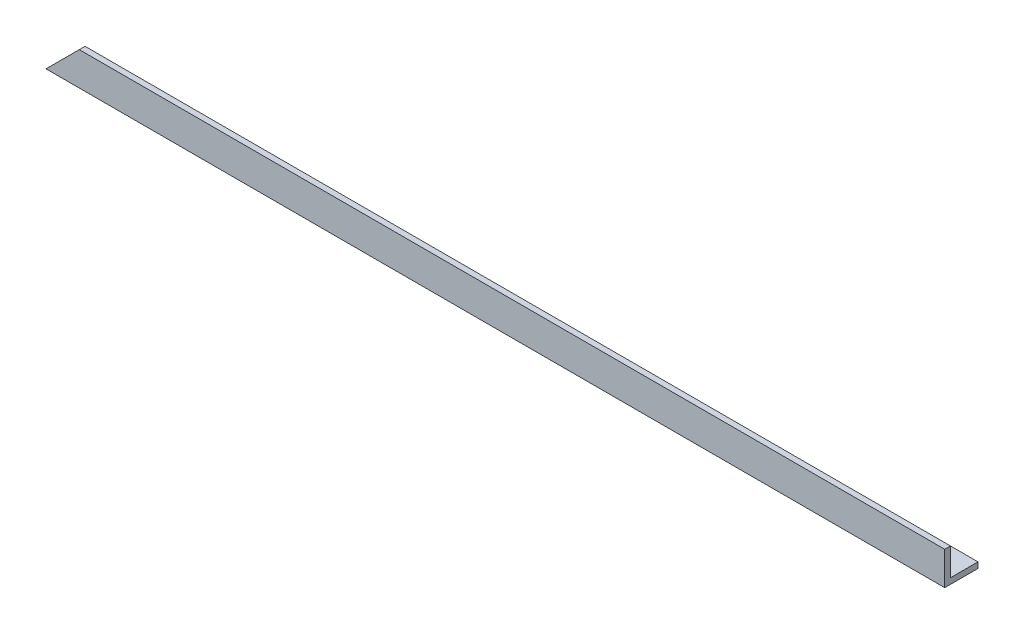
ISO-10303-21;
HEADER;
FILE_DESCRIPTION(('STEP AP214'),'2;1');
FILE_NAME('part.step','',(''),(''),'','','');
FILE_SCHEMA(('AUTOMOTIVE_DESIGN { 1 0 10303 214 1 1 1 1 }'));
ENDSEC;
DATA;
#1=APPLICATION_CONTEXT('core data for automotive mechanical design processes');
#2=APPLICATION_PROTOCOL_DEFINITION('international standard','automotive_design',2000,#1);
#3=PRODUCT_CONTEXT('',#1,'mechanical');
#4=PRODUCT('Part','Part','',(#3));
#5=PRODUCT_RELATED_PRODUCT_CATEGORY('part','',(#4));
#6=PRODUCT_DEFINITION_FORMATION('','',#4);
#7=PRODUCT_DEFINITION_CONTEXT('part definition',#1,'design');
#8=PRODUCT_DEFINITION('design','',#6,#7);
#9=PRODUCT_DEFINITION_SHAPE('','',#8);
#10=(LENGTH_UNIT() NAMED_UNIT(*) SI_UNIT(.MILLI.,.METRE.));
#11=(NAMED_UNIT(*) PLANE_ANGLE_UNIT() SI_UNIT($,.RADIAN.));
#12=(NAMED_UNIT(*) SI_UNIT($,.STERADIAN.) SOLID_ANGLE_UNIT());
#13=UNCERTAINTY_MEASURE_WITH_UNIT(LENGTH_MEASURE(1.E-05),#10,'distance_accuracy_value','');
#14=(GEOMETRIC_REPRESENTATION_CONTEXT(3) GLOBAL_UNCERTAINTY_ASSIGNED_CONTEXT((#13)) GLOBAL_UNIT_ASSIGNED_CONTEXT((#10,
#11,#12)) REPRESENTATION_CONTEXT('',''));
#15=CARTESIAN_POINT('',(0.,0.,0.));
#16=DIRECTION('',(0.,0.,1.));
#17=DIRECTION('',(1.,0.,0.));
#18=AXIS2_PLACEMENT_3D('',#15,#16,#17);
#19=CARTESIAN_POINT('',(540.,20.,0.));
#20=DIRECTION('',(0.,0.,-1.));
#21=DIRECTION('',(0.,1.,0.));
#22=AXIS2_PLACEMENT_3D('',#19,#20,#21);
#23=PLANE('',#22);
#24=DIRECTION('',(-0.707106781186548,-0.707106781186548,0.));
#25=VECTOR('',#24,1.);
#26=CARTESIAN_POINT('',(0.,0.,0.));
#27=LINE('',#26,#25);
#28=CARTESIAN_POINT('',(20.,20.,0.));
#29=VERTEX_POINT('',#28);
#30=CARTESIAN_POINT('',(0.,0.,0.));
#31=VERTEX_POINT('',#30);
#32=EDGE_CURVE('E84',#29,#31,#27,.T.);
#33=ORIENTED_EDGE('',*,*,#32,.T.);
#34=DIRECTION('',(-1.,0.,0.));
#35=VECTOR('',#34,1.);
#36=CARTESIAN_POINT('',(540.,0.,0.));
#37=LINE('',#36,#35);
#38=CARTESIAN_POINT('',(540.,0.,0.));
#39=VERTEX_POINT('',#38);
#40=EDGE_CURVE('E11',#39,#31,#37,.T.);
#41=ORIENTED_EDGE('',*,*,#40,.F.);
#42=DIRECTION('',(0.,-1.,0.));
#43=VECTOR('',#42,1.);
#44=CARTESIAN_POINT('',(540.,20.,0.));
#45=LINE('',#44,#43);
#46=CARTESIAN_POINT('',(540.,20.,0.));
#47=VERTEX_POINT('',#46);
#48=EDGE_CURVE('E106',#47,#39,#45,.T.);
#49=ORIENTED_EDGE('',*,*,#48,.F.);
#50=DIRECTION('',(-1.,0.,0.));
#51=VECTOR('',#50,1.);
#52=CARTESIAN_POINT('',(540.,20.,0.));
#53=LINE('',#52,#51);
#54=EDGE_CURVE('E100',#47,#29,#53,.T.);
#55=ORIENTED_EDGE('',*,*,#54,.T.);
#56=EDGE_LOOP('',(#33,#41,#49,#55));
#57=FACE_BOUND('',#56,.T.);
#58=ADVANCED_FACE('F37',(#57),#23,.F.);
#59=CARTESIAN_POINT('',(540.,0.,-20.));
#60=DIRECTION('',(0.,0.,1.));
#61=DIRECTION('',(1.,0.,0.));
#62=AXIS2_PLACEMENT_3D('',#59,#60,#61);
#63=PLANE('',#62);
#64=DIRECTION('',(-0.707106781186548,-0.707106781186548,0.));
#65=VECTOR('',#64,1.);
#66=CARTESIAN_POINT('',(0.,0.,-20.));
#67=LINE('',#66,#65);
#68=CARTESIAN_POINT('',(3.46117846701568,3.46117846701571,-20.));
#69=VERTEX_POINT('',#68);
#70=CARTESIAN_POINT('',(0.,0.,-20.));
#71=VERTEX_POINT('',#70);
#72=EDGE_CURVE('E95',#69,#71,#67,.T.);
#73=ORIENTED_EDGE('',*,*,#72,.F.);
#74=DIRECTION('',(-1.,0.,0.));
#75=VECTOR('',#74,1.);
#76=CARTESIAN_POINT('',(540.,3.46117846701572,-20.));
#77=LINE('',#76,#75);
#78=CARTESIAN_POINT('',(540.,3.46117846701572,-20.));
#79=VERTEX_POINT('',#78);
#80=EDGE_CURVE('E116',#79,#69,#77,.T.);
#81=ORIENTED_EDGE('',*,*,#80,.F.);
#82=DIRECTION('',(0.,1.,0.));
#83=VECTOR('',#82,1.);
#84=CARTESIAN_POINT('',(540.,0.,-20.));
#85=LINE('',#84,#83);
#86=CARTESIAN_POINT('',(540.,0.,-20.));
#87=VERTEX_POINT('',#86);
#88=EDGE_CURVE('E125',#87,#79,#85,.T.);
#89=ORIENTED_EDGE('',*,*,#88,.F.);
#90=DIRECTION('',(-1.,0.,0.));
#91=VECTOR('',#90,1.);
#92=CARTESIAN_POINT('',(540.,0.,-20.));
#93=LINE('',#92,#91);
#94=EDGE_CURVE('E45',#87,#71,#93,.T.);
#95=ORIENTED_EDGE('',*,*,#94,.T.);
#96=EDGE_LOOP('',(#73,#81,#89,#95));
#97=FACE_BOUND('',#96,.T.);
#98=ADVANCED_FACE('F123',(#97),#63,.F.);
#99=CARTESIAN_POINT('',(540.,3.46117846701572,-20.));
#100=DIRECTION('',(0.,-1.,0.));
#101=DIRECTION('',(0.,0.,-1.));
#102=AXIS2_PLACEMENT_3D('',#99,#100,#101);
#103=PLANE('',#102);
#104=DIRECTION('',(0.,0.,-1.));
#105=VECTOR('',#104,1.);
#106=CARTESIAN_POINT('',(3.46117846701577,3.46117846701572,-20.0000000000001));
#107=LINE('',#106,#105);
#108=CARTESIAN_POINT('',(3.46117846701582,3.46117846701577,-3.46117846701572));
#109=VERTEX_POINT('',#108);
#110=EDGE_CURVE('E129',#109,#69,#107,.T.);
#111=ORIENTED_EDGE('',*,*,#110,.F.);
#112=DIRECTION('',(-1.,0.,0.));
#113=VECTOR('',#112,1.);
#114=CARTESIAN_POINT('',(540.,3.46117846701572,-3.46117846701572));
#115=LINE('',#114,#113);
#116=CARTESIAN_POINT('',(540.,3.46117846701572,-3.46117846701572));
#117=VERTEX_POINT('',#116);
#118=EDGE_CURVE('E108',#117,#109,#115,.T.);
#119=ORIENTED_EDGE('',*,*,#118,.F.);
#120=DIRECTION('',(0.,0.,1.));
#121=VECTOR('',#120,1.);
#122=CARTESIAN_POINT('',(540.,3.46117846701572,-20.));
#123=LINE('',#122,#121);
#124=EDGE_CURVE('E137',#79,#117,#123,.T.);
#125=ORIENTED_EDGE('',*,*,#124,.F.);
#126=ORIENTED_EDGE('',*,*,#80,.T.);
#127=EDGE_LOOP('',(#111,#119,#125,#126));
#128=FACE_BOUND('',#127,.T.);
#129=ADVANCED_FACE('F146',(#128),#103,.F.);
#130=CARTESIAN_POINT('',(540.,3.46117846701572,-3.46117846701572));
#131=DIRECTION('',(0.,0.,1.));
#132=DIRECTION('',(1.,0.,0.));
#133=AXIS2_PLACEMENT_3D('',#130,#131,#132);
#134=PLANE('',#133);
#135=DIRECTION('',(-0.707106781186548,-0.707106781186548,0.));
#136=VECTOR('',#135,1.);
#137=CARTESIAN_POINT('',(271.730589233508,271.730589233508,-3.46117846701572));
#138=LINE('',#137,#136);
#139=CARTESIAN_POINT('',(20.,20.,-3.46117846701572));
#140=VERTEX_POINT('',#139);
#141=EDGE_CURVE('E104',#140,#109,#138,.T.);
#142=ORIENTED_EDGE('',*,*,#141,.F.);
#143=DIRECTION('',(-1.,0.,0.));
#144=VECTOR('',#143,1.);
#145=CARTESIAN_POINT('',(540.,20.,-3.46117846701572));
#146=LINE('',#145,#144);
#147=CARTESIAN_POINT('',(540.,20.,-3.46117846701572));
#148=VERTEX_POINT('',#147);
#149=EDGE_CURVE('E103',#148,#140,#146,.T.);
#150=ORIENTED_EDGE('',*,*,#149,.F.);
#151=DIRECTION('',(0.,1.,0.));
#152=VECTOR('',#151,1.);
#153=CARTESIAN_POINT('',(540.,3.46117846701572,-3.46117846701572));
#154=LINE('',#153,#152);
#155=EDGE_CURVE('E110',#117,#148,#154,.T.);
#156=ORIENTED_EDGE('',*,*,#155,.F.);
#157=ORIENTED_EDGE('',*,*,#118,.T.);
#158=EDGE_LOOP('',(#142,#150,#156,#157));
#159=FACE_BOUND('',#158,.T.);
#160=ADVANCED_FACE('F144',(#159),#134,.F.);
#161=CARTESIAN_POINT('',(540.,20.,-3.46117846701572));
#162=DIRECTION('',(0.,-1.,0.));
#163=DIRECTION('',(0.,0.,-1.));
#164=AXIS2_PLACEMENT_3D('',#161,#162,#163);
#165=PLANE('',#164);
#166=DIRECTION('',(0.,0.,1.));
#167=VECTOR('',#166,1.);
#168=CARTESIAN_POINT('',(20.,20.,-20.));
#169=LINE('',#168,#167);
#170=EDGE_CURVE('E87',#140,#29,#169,.T.);
#171=ORIENTED_EDGE('',*,*,#170,.T.);
#172=ORIENTED_EDGE('',*,*,#54,.F.);
#173=DIRECTION('',(0.,0.,1.));
#174=VECTOR('',#173,1.);
#175=CARTESIAN_POINT('',(540.,20.,-3.46117846701572));
#176=LINE('',#175,#174);
#177=EDGE_CURVE('E52',#148,#47,#176,.T.);
#178=ORIENTED_EDGE('',*,*,#177,.F.);
#179=ORIENTED_EDGE('',*,*,#149,.T.);
#180=EDGE_LOOP('',(#171,#172,#178,#179));
#181=FACE_BOUND('',#180,.T.);
#182=ADVANCED_FACE('F99',(#181),#165,.F.);
#183=CARTESIAN_POINT('',(540.,0.,0.));
#184=DIRECTION('',(0.,1.,0.));
#185=DIRECTION('',(0.,0.,1.));
#186=AXIS2_PLACEMENT_3D('',#183,#184,#185);
#187=PLANE('',#186);
#188=DIRECTION('',(0.,0.,-1.));
#189=VECTOR('',#188,1.);
#190=CARTESIAN_POINT('',(0.,0.,0.));
#191=LINE('',#190,#189);
#192=EDGE_CURVE('E91',#31,#71,#191,.T.);
#193=ORIENTED_EDGE('',*,*,#192,.T.);
#194=ORIENTED_EDGE('',*,*,#94,.F.);
#195=DIRECTION('',(0.,0.,-1.));
#196=VECTOR('',#195,1.);
#197=CARTESIAN_POINT('',(540.,0.,0.));
#198=LINE('',#197,#196);
#199=EDGE_CURVE('E128',#39,#87,#198,.T.);
#200=ORIENTED_EDGE('',*,*,#199,.F.);
#201=ORIENTED_EDGE('',*,*,#40,.T.);
#202=EDGE_LOOP('',(#193,#194,#200,#201));
#203=FACE_BOUND('',#202,.T.);
#204=ADVANCED_FACE('F127',(#203),#187,.F.);
#205=CARTESIAN_POINT('',(540.,0.,0.));
#206=DIRECTION('',(1.,0.,0.));
#207=DIRECTION('',(0.,0.,-1.));
#208=AXIS2_PLACEMENT_3D('',#205,#206,#207);
#209=PLANE('',#208);
#210=ORIENTED_EDGE('',*,*,#48,.T.);
#211=ORIENTED_EDGE('',*,*,#199,.T.);
#212=ORIENTED_EDGE('',*,*,#88,.T.);
#213=ORIENTED_EDGE('',*,*,#124,.T.);
#214=ORIENTED_EDGE('',*,*,#155,.T.);
#215=ORIENTED_EDGE('',*,*,#177,.T.);
#216=EDGE_LOOP('',(#210,#211,#212,#213,#214,#215));
#217=FACE_BOUND('',#216,.T.);
#218=ADVANCED_FACE('F140',(#217),#209,.T.);
#219=CARTESIAN_POINT('',(0.,0.,-20.));
#220=DIRECTION('',(-0.707106781186548,0.707106781186548,0.));
#221=DIRECTION('',(-0.707106781186548,-0.707106781186548,0.));
#222=AXIS2_PLACEMENT_3D('',#219,#220,#221);
#223=PLANE('',#222);
#224=ORIENTED_EDGE('',*,*,#110,.T.);
#225=ORIENTED_EDGE('',*,*,#72,.T.);
#226=ORIENTED_EDGE('',*,*,#192,.F.);
#227=ORIENTED_EDGE('',*,*,#32,.F.);
#228=ORIENTED_EDGE('',*,*,#170,.F.);
#229=ORIENTED_EDGE('',*,*,#141,.T.);
#230=EDGE_LOOP('',(#224,#225,#226,#227,#228,#229));
#231=FACE_BOUND('',#230,.T.);
#232=ADVANCED_FACE('F86',(#231),#223,.T.);
#233=CLOSED_SHELL('',(#58,#98,#129,#160,#182,#204,#218,#232));
#234=MANIFOLD_SOLID_BREP('B2',#233);
#235=ADVANCED_BREP_SHAPE_REPRESENTATION('',(#18,#234),#14);
#236=SHAPE_DEFINITION_REPRESENTATION(#9,#235);
ENDSEC;
END-ISO-10303-21;
